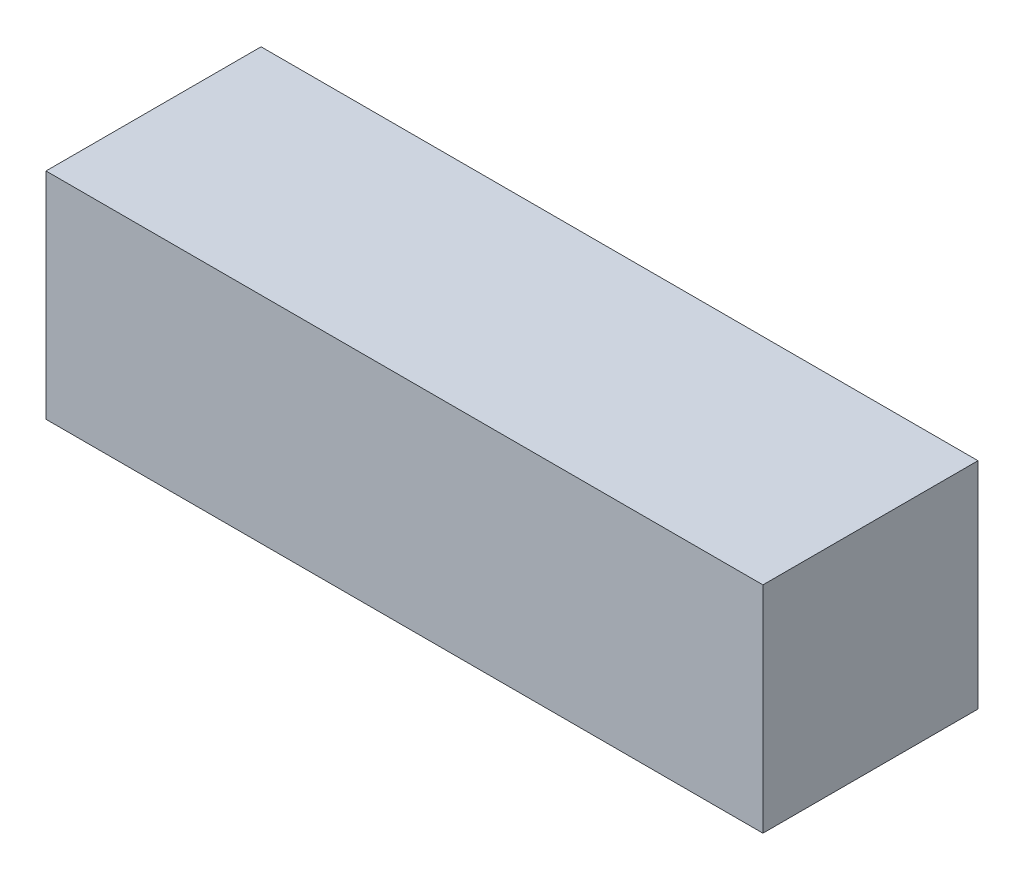
ISO-10303-21;
HEADER;
FILE_DESCRIPTION(('STEP AP214'),'2;1');
FILE_NAME('part.step','',(''),(''),'','','');
FILE_SCHEMA(('AUTOMOTIVE_DESIGN { 1 0 10303 214 1 1 1 1 }'));
ENDSEC;
DATA;
#1=APPLICATION_CONTEXT('core data for automotive mechanical design processes');
#2=APPLICATION_PROTOCOL_DEFINITION('international standard','automotive_design',2000,#1);
#3=PRODUCT_CONTEXT('',#1,'mechanical');
#4=PRODUCT('Part','Part','',(#3));
#5=PRODUCT_RELATED_PRODUCT_CATEGORY('part','',(#4));
#6=PRODUCT_DEFINITION_FORMATION('','',#4);
#7=PRODUCT_DEFINITION_CONTEXT('part definition',#1,'design');
#8=PRODUCT_DEFINITION('design','',#6,#7);
#9=PRODUCT_DEFINITION_SHAPE('','',#8);
#10=(LENGTH_UNIT() NAMED_UNIT(*) SI_UNIT(.MILLI.,.METRE.));
#11=(NAMED_UNIT(*) PLANE_ANGLE_UNIT() SI_UNIT($,.RADIAN.));
#12=(NAMED_UNIT(*) SI_UNIT($,.STERADIAN.) SOLID_ANGLE_UNIT());
#13=UNCERTAINTY_MEASURE_WITH_UNIT(LENGTH_MEASURE(1.E-05),#10,'distance_accuracy_value','');
#14=(GEOMETRIC_REPRESENTATION_CONTEXT(3) GLOBAL_UNCERTAINTY_ASSIGNED_CONTEXT((#13)) GLOBAL_UNIT_ASSIGNED_CONTEXT((#10,
#11,#12)) REPRESENTATION_CONTEXT('',''));
#15=CARTESIAN_POINT('',(0.,0.,0.));
#16=DIRECTION('',(0.,0.,1.));
#17=DIRECTION('',(1.,0.,0.));
#18=AXIS2_PLACEMENT_3D('',#15,#16,#17);
#19=CARTESIAN_POINT('',(20.,3.,-3.));
#20=DIRECTION('',(0.,0.,1.));
#21=DIRECTION('',(0.,-1.,0.));
#22=AXIS2_PLACEMENT_3D('',#19,#20,#21);
#23=PLANE('',#22);
#24=DIRECTION('',(0.,1.,0.));
#25=VECTOR('',#24,1.);
#26=CARTESIAN_POINT('',(0.,3.,-3.));
#27=LINE('',#26,#25);
#28=CARTESIAN_POINT('',(0.,-3.,-3.));
#29=VERTEX_POINT('',#28);
#30=CARTESIAN_POINT('',(0.,3.,-3.));
#31=VERTEX_POINT('',#30);
#32=EDGE_CURVE('E97',#29,#31,#27,.T.);
#33=ORIENTED_EDGE('',*,*,#32,.T.);
#34=DIRECTION('',(-1.,0.,0.));
#35=VECTOR('',#34,1.);
#36=CARTESIAN_POINT('',(20.,3.,-3.));
#37=LINE('',#36,#35);
#38=CARTESIAN_POINT('',(20.,3.,-3.));
#39=VERTEX_POINT('',#38);
#40=EDGE_CURVE('E11',#39,#31,#37,.T.);
#41=ORIENTED_EDGE('',*,*,#40,.F.);
#42=DIRECTION('',(0.,1.,0.));
#43=VECTOR('',#42,1.);
#44=CARTESIAN_POINT('',(20.,3.,-3.));
#45=LINE('',#44,#43);
#46=CARTESIAN_POINT('',(20.,-3.,-3.));
#47=VERTEX_POINT('',#46);
#48=EDGE_CURVE('E85',#47,#39,#45,.T.);
#49=ORIENTED_EDGE('',*,*,#48,.F.);
#50=DIRECTION('',(-1.,0.,0.));
#51=VECTOR('',#50,1.);
#52=CARTESIAN_POINT('',(20.,-3.,-3.));
#53=LINE('',#52,#51);
#54=EDGE_CURVE('E93',#47,#29,#53,.T.);
#55=ORIENTED_EDGE('',*,*,#54,.T.);
#56=EDGE_LOOP('',(#33,#41,#49,#55));
#57=FACE_BOUND('',#56,.T.);
#58=ADVANCED_FACE('F34',(#57),#23,.F.);
#59=CARTESIAN_POINT('',(20.,3.,3.));
#60=DIRECTION('',(0.,-1.,0.));
#61=DIRECTION('',(0.,0.,-1.));
#62=AXIS2_PLACEMENT_3D('',#59,#60,#61);
#63=PLANE('',#62);
#64=DIRECTION('',(0.,0.,1.));
#65=VECTOR('',#64,1.);
#66=CARTESIAN_POINT('',(0.,3.,3.));
#67=LINE('',#66,#65);
#68=CARTESIAN_POINT('',(0.,3.,3.));
#69=VERTEX_POINT('',#68);
#70=EDGE_CURVE('E89',#31,#69,#67,.T.);
#71=ORIENTED_EDGE('',*,*,#70,.T.);
#72=DIRECTION('',(-1.,0.,0.));
#73=VECTOR('',#72,1.);
#74=CARTESIAN_POINT('',(20.,3.,3.));
#75=LINE('',#74,#73);
#76=CARTESIAN_POINT('',(20.,3.,3.));
#77=VERTEX_POINT('',#76);
#78=EDGE_CURVE('E42',#77,#69,#75,.T.);
#79=ORIENTED_EDGE('',*,*,#78,.F.);
#80=DIRECTION('',(0.,0.,1.));
#81=VECTOR('',#80,1.);
#82=CARTESIAN_POINT('',(20.,3.,3.));
#83=LINE('',#82,#81);
#84=EDGE_CURVE('E80',#39,#77,#83,.T.);
#85=ORIENTED_EDGE('',*,*,#84,.F.);
#86=ORIENTED_EDGE('',*,*,#40,.T.);
#87=EDGE_LOOP('',(#71,#79,#85,#86));
#88=FACE_BOUND('',#87,.T.);
#89=ADVANCED_FACE('F88',(#88),#63,.F.);
#90=CARTESIAN_POINT('',(20.,3.,3.));
#91=DIRECTION('',(0.,0.,-1.));
#92=DIRECTION('',(0.,1.,0.));
#93=AXIS2_PLACEMENT_3D('',#90,#91,#92);
#94=PLANE('',#93);
#95=DIRECTION('',(0.,-1.,0.));
#96=VECTOR('',#95,1.);
#97=CARTESIAN_POINT('',(0.,3.,3.));
#98=LINE('',#97,#96);
#99=CARTESIAN_POINT('',(0.,-3.,3.));
#100=VERTEX_POINT('',#99);
#101=EDGE_CURVE('E67',#69,#100,#98,.T.);
#102=ORIENTED_EDGE('',*,*,#101,.T.);
#103=DIRECTION('',(-1.,0.,0.));
#104=VECTOR('',#103,1.);
#105=CARTESIAN_POINT('',(20.,-3.,3.));
#106=LINE('',#105,#104);
#107=CARTESIAN_POINT('',(20.,-3.,3.));
#108=VERTEX_POINT('',#107);
#109=EDGE_CURVE('E90',#108,#100,#106,.T.);
#110=ORIENTED_EDGE('',*,*,#109,.F.);
#111=DIRECTION('',(0.,-1.,0.));
#112=VECTOR('',#111,1.);
#113=CARTESIAN_POINT('',(20.,3.,3.));
#114=LINE('',#113,#112);
#115=EDGE_CURVE('E83',#77,#108,#114,.T.);
#116=ORIENTED_EDGE('',*,*,#115,.F.);
#117=ORIENTED_EDGE('',*,*,#78,.T.);
#118=EDGE_LOOP('',(#102,#110,#116,#117));
#119=FACE_BOUND('',#118,.T.);
#120=ADVANCED_FACE('F91',(#119),#94,.F.);
#121=CARTESIAN_POINT('',(20.,-3.,3.));
#122=DIRECTION('',(0.,1.,0.));
#123=DIRECTION('',(0.,0.,1.));
#124=AXIS2_PLACEMENT_3D('',#121,#122,#123);
#125=PLANE('',#124);
#126=DIRECTION('',(0.,0.,-1.));
#127=VECTOR('',#126,1.);
#128=CARTESIAN_POINT('',(0.,-3.,3.));
#129=LINE('',#128,#127);
#130=EDGE_CURVE('E73',#100,#29,#129,.T.);
#131=ORIENTED_EDGE('',*,*,#130,.T.);
#132=ORIENTED_EDGE('',*,*,#54,.F.);
#133=DIRECTION('',(0.,0.,-1.));
#134=VECTOR('',#133,1.);
#135=CARTESIAN_POINT('',(20.,-3.,3.));
#136=LINE('',#135,#134);
#137=EDGE_CURVE('E50',#108,#47,#136,.T.);
#138=ORIENTED_EDGE('',*,*,#137,.F.);
#139=ORIENTED_EDGE('',*,*,#109,.T.);
#140=EDGE_LOOP('',(#131,#132,#138,#139));
#141=FACE_BOUND('',#140,.T.);
#142=ADVANCED_FACE('F104',(#141),#125,.F.);
#143=CARTESIAN_POINT('',(20.,0.,0.));
#144=DIRECTION('',(1.,0.,0.));
#145=DIRECTION('',(0.,0.,-1.));
#146=AXIS2_PLACEMENT_3D('',#143,#144,#145);
#147=PLANE('',#146);
#148=ORIENTED_EDGE('',*,*,#48,.T.);
#149=ORIENTED_EDGE('',*,*,#84,.T.);
#150=ORIENTED_EDGE('',*,*,#115,.T.);
#151=ORIENTED_EDGE('',*,*,#137,.T.);
#152=EDGE_LOOP('',(#148,#149,#150,#151));
#153=FACE_BOUND('',#152,.T.);
#154=ADVANCED_FACE('F81',(#153),#147,.T.);
#155=CARTESIAN_POINT('',(0.,0.,0.));
#156=DIRECTION('',(1.,0.,0.));
#157=DIRECTION('',(0.,0.,-1.));
#158=AXIS2_PLACEMENT_3D('',#155,#156,#157);
#159=PLANE('',#158);
#160=ORIENTED_EDGE('',*,*,#32,.F.);
#161=ORIENTED_EDGE('',*,*,#130,.F.);
#162=ORIENTED_EDGE('',*,*,#101,.F.);
#163=ORIENTED_EDGE('',*,*,#70,.F.);
#164=EDGE_LOOP('',(#160,#161,#162,#163));
#165=FACE_BOUND('',#164,.T.);
#166=ADVANCED_FACE('F107',(#165),#159,.F.);
#167=CLOSED_SHELL('',(#58,#89,#120,#142,#154,#166));
#168=MANIFOLD_SOLID_BREP('B2',#167);
#169=ADVANCED_BREP_SHAPE_REPRESENTATION('',(#18,#168),#14);
#170=SHAPE_DEFINITION_REPRESENTATION(#9,#169);
ENDSEC;
END-ISO-10303-21;
